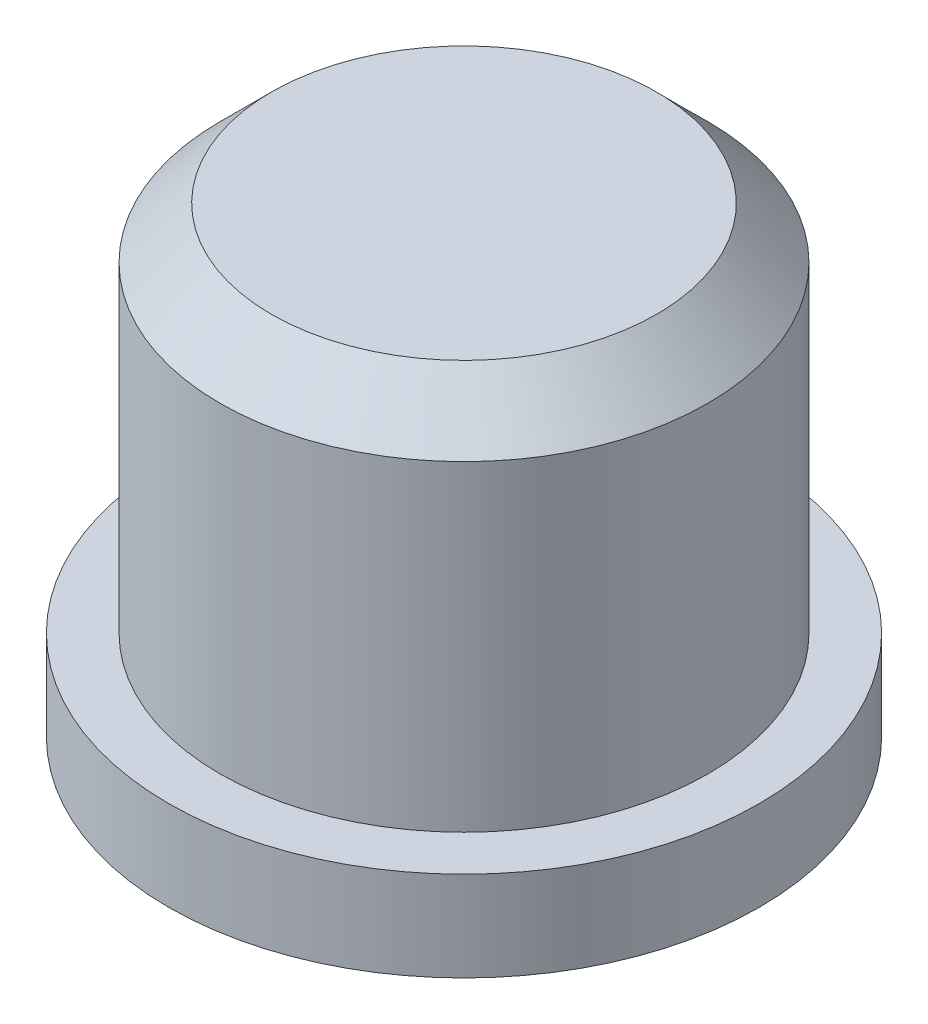
ISO-10303-21;
HEADER;
FILE_DESCRIPTION(('STEP AP214'),'2;1');
FILE_NAME('part.step','',(''),(''),'','','');
FILE_SCHEMA(('AUTOMOTIVE_DESIGN { 1 0 10303 214 1 1 1 1 }'));
ENDSEC;
DATA;
#1=APPLICATION_CONTEXT('core data for automotive mechanical design processes');
#2=APPLICATION_PROTOCOL_DEFINITION('international standard','automotive_design',2000,#1);
#3=PRODUCT_CONTEXT('',#1,'mechanical');
#4=PRODUCT('Part','Part','',(#3));
#5=PRODUCT_RELATED_PRODUCT_CATEGORY('part','',(#4));
#6=PRODUCT_DEFINITION_FORMATION('','',#4);
#7=PRODUCT_DEFINITION_CONTEXT('part definition',#1,'design');
#8=PRODUCT_DEFINITION('design','',#6,#7);
#9=PRODUCT_DEFINITION_SHAPE('','',#8);
#10=(LENGTH_UNIT() NAMED_UNIT(*) SI_UNIT(.MILLI.,.METRE.));
#11=(NAMED_UNIT(*) PLANE_ANGLE_UNIT() SI_UNIT($,.RADIAN.));
#12=(NAMED_UNIT(*) SI_UNIT($,.STERADIAN.) SOLID_ANGLE_UNIT());
#13=UNCERTAINTY_MEASURE_WITH_UNIT(LENGTH_MEASURE(1.E-05),#10,'distance_accuracy_value','');
#14=(GEOMETRIC_REPRESENTATION_CONTEXT(3) GLOBAL_UNCERTAINTY_ASSIGNED_CONTEXT((#13)) GLOBAL_UNIT_ASSIGNED_CONTEXT((#10,
#11,#12)) REPRESENTATION_CONTEXT('',''));
#15=CARTESIAN_POINT('',(0.,0.,0.));
#16=DIRECTION('',(0.,0.,1.));
#17=DIRECTION('',(1.,0.,0.));
#18=AXIS2_PLACEMENT_3D('',#15,#16,#17);
#19=CARTESIAN_POINT('',(0.,9.,0.));
#20=DIRECTION('',(0.,-1.,0.));
#21=DIRECTION('',(0.,0.,-1.));
#22=AXIS2_PLACEMENT_3D('',#19,#20,#21);
#23=CYLINDRICAL_SURFACE('',#22,4.75);
#24=CARTESIAN_POINT('',(0.,8.,0.));
#25=DIRECTION('',(0.,1.,0.));
#26=DIRECTION('',(0.,0.,1.));
#27=AXIS2_PLACEMENT_3D('',#24,#25,#26);
#28=CIRCLE('',#27,4.75);
#29=CARTESIAN_POINT('',(0.,8.,4.75));
#30=VERTEX_POINT('',#29);
#31=EDGE_CURVE('E10',#30,#30,#28,.F.);
#32=ORIENTED_EDGE('',*,*,#31,.T.);
#33=EDGE_LOOP('',(#32));
#34=FACE_BOUND('',#33,.T.);
#35=CARTESIAN_POINT('',(0.,1.75,0.));
#36=DIRECTION('',(0.,-1.,0.));
#37=DIRECTION('',(0.,0.,-1.));
#38=AXIS2_PLACEMENT_3D('',#35,#36,#37);
#39=CIRCLE('',#38,4.75);
#40=CARTESIAN_POINT('',(0.,1.75,-4.75));
#41=VERTEX_POINT('',#40);
#42=EDGE_CURVE('E53',#41,#41,#39,.T.);
#43=ORIENTED_EDGE('',*,*,#42,.F.);
#44=EDGE_LOOP('',(#43));
#45=FACE_BOUND('',#44,.T.);
#46=ADVANCED_FACE('F39',(#34,#45),#23,.T.);
#47=CARTESIAN_POINT('',(0.,9.,0.));
#48=DIRECTION('',(0.,1.,0.));
#49=DIRECTION('',(0.,0.,1.));
#50=AXIS2_PLACEMENT_3D('',#47,#48,#49);
#51=PLANE('',#50);
#52=CARTESIAN_POINT('',(0.,9.,0.));
#53=DIRECTION('',(0.,1.,0.));
#54=DIRECTION('',(0.,0.,1.));
#55=AXIS2_PLACEMENT_3D('',#52,#53,#54);
#56=CIRCLE('',#55,3.75);
#57=CARTESIAN_POINT('',(0.,9.,3.75));
#58=VERTEX_POINT('',#57);
#59=EDGE_CURVE('E48',#58,#58,#56,.T.);
#60=ORIENTED_EDGE('',*,*,#59,.T.);
#61=EDGE_LOOP('',(#60));
#62=FACE_BOUND('',#61,.T.);
#63=ADVANCED_FACE('F83',(#62),#51,.T.);
#64=CARTESIAN_POINT('',(0.,1.75,0.));
#65=DIRECTION('',(0.,-1.,0.));
#66=DIRECTION('',(0.,0.,-1.));
#67=AXIS2_PLACEMENT_3D('',#64,#65,#66);
#68=CYLINDRICAL_SURFACE('',#67,5.75);
#69=CARTESIAN_POINT('',(0.,1.75,0.));
#70=DIRECTION('',(0.,-1.,0.));
#71=DIRECTION('',(0.,0.,-1.));
#72=AXIS2_PLACEMENT_3D('',#69,#70,#71);
#73=CIRCLE('',#72,5.75);
#74=CARTESIAN_POINT('',(0.,1.75,-5.75));
#75=VERTEX_POINT('',#74);
#76=EDGE_CURVE('E58',#75,#75,#73,.T.);
#77=ORIENTED_EDGE('',*,*,#76,.T.);
#78=EDGE_LOOP('',(#77));
#79=FACE_BOUND('',#78,.T.);
#80=CARTESIAN_POINT('',(0.,0.,0.));
#81=DIRECTION('',(0.,-1.,0.));
#82=DIRECTION('',(0.,0.,-1.));
#83=AXIS2_PLACEMENT_3D('',#80,#81,#82);
#84=CIRCLE('',#83,5.75);
#85=CARTESIAN_POINT('',(0.,0.,-5.75));
#86=VERTEX_POINT('',#85);
#87=EDGE_CURVE('E61',#86,#86,#84,.T.);
#88=ORIENTED_EDGE('',*,*,#87,.F.);
#89=EDGE_LOOP('',(#88));
#90=FACE_BOUND('',#89,.T.);
#91=ADVANCED_FACE('F69',(#79,#90),#68,.T.);
#92=CARTESIAN_POINT('',(0.,1.75,0.));
#93=DIRECTION('',(0.,-1.,0.));
#94=DIRECTION('',(0.,0.,-1.));
#95=AXIS2_PLACEMENT_3D('',#92,#93,#94);
#96=PLANE('',#95);
#97=ORIENTED_EDGE('',*,*,#42,.T.);
#98=EDGE_LOOP('',(#97));
#99=FACE_BOUND('',#98,.T.);
#100=ORIENTED_EDGE('',*,*,#76,.F.);
#101=EDGE_LOOP('',(#100));
#102=FACE_BOUND('',#101,.T.);
#103=ADVANCED_FACE('F72',(#99,#102),#96,.F.);
#104=CARTESIAN_POINT('',(0.,0.,0.));
#105=DIRECTION('',(0.,1.,0.));
#106=DIRECTION('',(0.,0.,1.));
#107=AXIS2_PLACEMENT_3D('',#104,#105,#106);
#108=PLANE('',#107);
#109=ORIENTED_EDGE('',*,*,#87,.T.);
#110=EDGE_LOOP('',(#109));
#111=FACE_BOUND('',#110,.T.);
#112=ADVANCED_FACE('F74',(#111),#108,.F.);
#113=CARTESIAN_POINT('',(0.,9.,0.));
#114=DIRECTION('',(0.,-1.,0.));
#115=DIRECTION('',(0.,0.,-1.));
#116=AXIS2_PLACEMENT_3D('',#113,#114,#115);
#117=CONICAL_SURFACE('',#116,3.75,0.785398163397444);
#118=ORIENTED_EDGE('',*,*,#31,.F.);
#119=EDGE_LOOP('',(#118));
#120=FACE_BOUND('',#119,.T.);
#121=ORIENTED_EDGE('',*,*,#59,.F.);
#122=EDGE_LOOP('',(#121));
#123=FACE_BOUND('',#122,.T.);
#124=ADVANCED_FACE('F42',(#120,#123),#117,.T.);
#125=CLOSED_SHELL('',(#46,#63,#91,#103,#112,#124));
#126=MANIFOLD_SOLID_BREP('B2',#125);
#127=ADVANCED_BREP_SHAPE_REPRESENTATION('',(#18,#126),#14);
#128=SHAPE_DEFINITION_REPRESENTATION(#9,#127);
ENDSEC;
END-ISO-10303-21;
